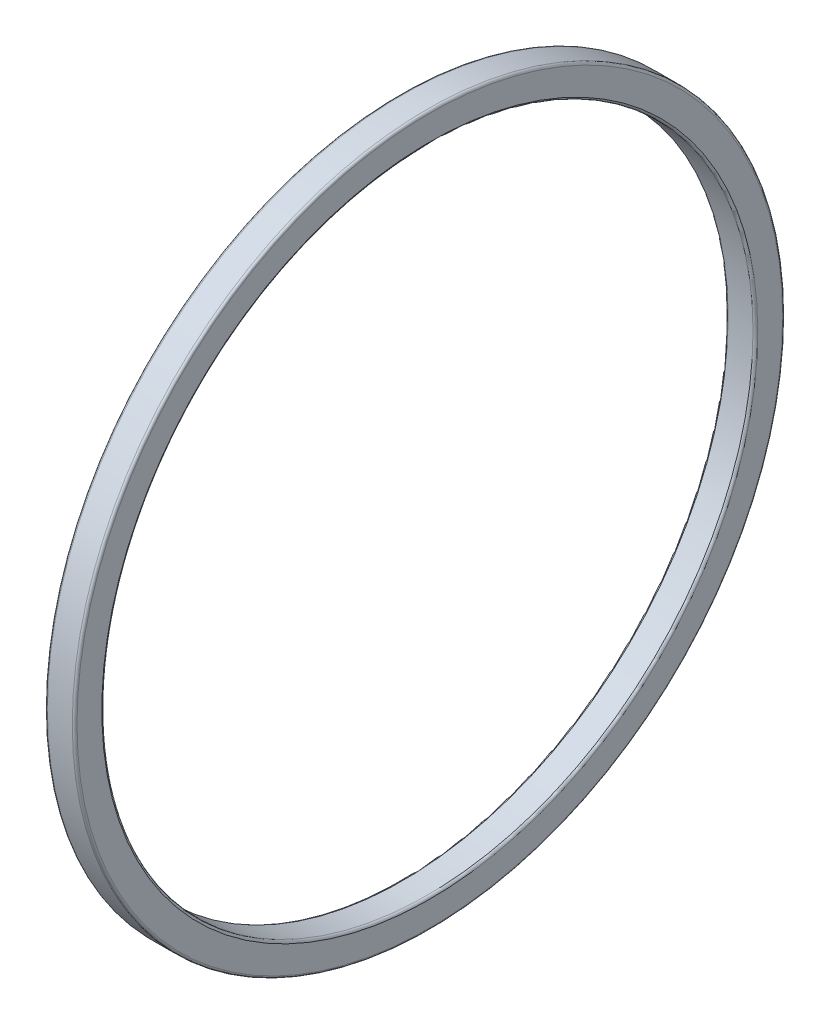
ISO-10303-21;
HEADER;
FILE_DESCRIPTION(('STEP AP214'),'2;1');
FILE_NAME('part.step','',(''),(''),'','','');
FILE_SCHEMA(('AUTOMOTIVE_DESIGN { 1 0 10303 214 1 1 1 1 }'));
ENDSEC;
DATA;
#1=APPLICATION_CONTEXT('core data for automotive mechanical design processes');
#2=APPLICATION_PROTOCOL_DEFINITION('international standard','automotive_design',2000,#1);
#3=PRODUCT_CONTEXT('',#1,'mechanical');
#4=PRODUCT('Part','Part','',(#3));
#5=PRODUCT_RELATED_PRODUCT_CATEGORY('part','',(#4));
#6=PRODUCT_DEFINITION_FORMATION('','',#4);
#7=PRODUCT_DEFINITION_CONTEXT('part definition',#1,'design');
#8=PRODUCT_DEFINITION('design','',#6,#7);
#9=PRODUCT_DEFINITION_SHAPE('','',#8);
#10=(LENGTH_UNIT() NAMED_UNIT(*) SI_UNIT(.MILLI.,.METRE.));
#11=(NAMED_UNIT(*) PLANE_ANGLE_UNIT() SI_UNIT($,.RADIAN.));
#12=(NAMED_UNIT(*) SI_UNIT($,.STERADIAN.) SOLID_ANGLE_UNIT());
#13=UNCERTAINTY_MEASURE_WITH_UNIT(LENGTH_MEASURE(1.E-05),#10,'distance_accuracy_value','');
#14=(GEOMETRIC_REPRESENTATION_CONTEXT(3) GLOBAL_UNCERTAINTY_ASSIGNED_CONTEXT((#13)) GLOBAL_UNIT_ASSIGNED_CONTEXT((#10,
#11,#12)) REPRESENTATION_CONTEXT('',''));
#15=CARTESIAN_POINT('',(0.,0.,0.));
#16=DIRECTION('',(0.,0.,1.));
#17=DIRECTION('',(1.,0.,0.));
#18=AXIS2_PLACEMENT_3D('',#15,#16,#17);
#19=CARTESIAN_POINT('',(3.175,0.,0.));
#20=DIRECTION('',(1.,0.,0.));
#21=DIRECTION('',(0.,0.,-1.));
#22=AXIS2_PLACEMENT_3D('',#19,#20,#21);
#23=PLANE('',#22);
#24=CARTESIAN_POINT('',(3.175,0.,0.));
#25=DIRECTION('',(1.,0.,0.));
#26=DIRECTION('',(0.,0.,-1.));
#27=AXIS2_PLACEMENT_3D('',#24,#25,#26);
#28=CIRCLE('',#27,70.358);
#29=CARTESIAN_POINT('',(3.175,0.,-70.358));
#30=VERTEX_POINT('',#29);
#31=EDGE_CURVE('E10',#30,#30,#28,.F.);
#32=ORIENTED_EDGE('',*,*,#31,.T.);
#33=EDGE_LOOP('',(#32));
#34=FACE_BOUND('',#33,.T.);
#35=CARTESIAN_POINT('',(3.175,0.,0.));
#36=DIRECTION('',(1.,0.,0.));
#37=DIRECTION('',(0.,0.,-1.));
#38=AXIS2_PLACEMENT_3D('',#35,#36,#37);
#39=CIRCLE('',#38,75.692);
#40=CARTESIAN_POINT('',(3.175,0.,-75.692));
#41=VERTEX_POINT('',#40);
#42=EDGE_CURVE('E39',#41,#41,#39,.T.);
#43=ORIENTED_EDGE('',*,*,#42,.T.);
#44=EDGE_LOOP('',(#43));
#45=FACE_BOUND('',#44,.T.);
#46=ADVANCED_FACE('F32',(#34,#45),#23,.T.);
#47=CARTESIAN_POINT('',(-3.175,0.,0.));
#48=DIRECTION('',(1.,0.,0.));
#49=DIRECTION('',(0.,0.,-1.));
#50=AXIS2_PLACEMENT_3D('',#47,#48,#49);
#51=PLANE('',#50);
#52=CARTESIAN_POINT('',(-3.175,0.,0.));
#53=DIRECTION('',(1.,0.,0.));
#54=DIRECTION('',(0.,0.,-1.));
#55=AXIS2_PLACEMENT_3D('',#52,#53,#54);
#56=CIRCLE('',#55,70.358);
#57=CARTESIAN_POINT('',(-3.175,0.,-70.358));
#58=VERTEX_POINT('',#57);
#59=EDGE_CURVE('E58',#58,#58,#56,.T.);
#60=ORIENTED_EDGE('',*,*,#59,.T.);
#61=EDGE_LOOP('',(#60));
#62=FACE_BOUND('',#61,.T.);
#63=CARTESIAN_POINT('',(-3.175,0.,0.));
#64=DIRECTION('',(1.,0.,0.));
#65=DIRECTION('',(0.,0.,-1.));
#66=AXIS2_PLACEMENT_3D('',#63,#64,#65);
#67=CIRCLE('',#66,75.692);
#68=CARTESIAN_POINT('',(-3.175,0.,-75.692));
#69=VERTEX_POINT('',#68);
#70=EDGE_CURVE('E61',#69,#69,#67,.F.);
#71=ORIENTED_EDGE('',*,*,#70,.T.);
#72=EDGE_LOOP('',(#71));
#73=FACE_BOUND('',#72,.T.);
#74=ADVANCED_FACE('F65',(#62,#73),#51,.F.);
#75=CARTESIAN_POINT('',(3.175,0.,0.));
#76=DIRECTION('',(-1.,0.,0.));
#77=DIRECTION('',(0.,0.,1.));
#78=AXIS2_PLACEMENT_3D('',#75,#76,#77);
#79=CYLINDRICAL_SURFACE('',#78,76.2);
#80=CARTESIAN_POINT('',(-2.667,0.,0.));
#81=DIRECTION('',(1.,0.,0.));
#82=DIRECTION('',(0.,0.,-1.));
#83=AXIS2_PLACEMENT_3D('',#80,#81,#82);
#84=CIRCLE('',#83,76.2);
#85=CARTESIAN_POINT('',(-2.667,0.,-76.2));
#86=VERTEX_POINT('',#85);
#87=EDGE_CURVE('E43',#86,#86,#84,.T.);
#88=ORIENTED_EDGE('',*,*,#87,.T.);
#89=EDGE_LOOP('',(#88));
#90=FACE_BOUND('',#89,.T.);
#91=CARTESIAN_POINT('',(2.667,0.,0.));
#92=DIRECTION('',(1.,0.,0.));
#93=DIRECTION('',(0.,0.,-1.));
#94=AXIS2_PLACEMENT_3D('',#91,#92,#93);
#95=CIRCLE('',#94,76.2);
#96=CARTESIAN_POINT('',(2.667,0.,-76.2));
#97=VERTEX_POINT('',#96);
#98=EDGE_CURVE('E47',#97,#97,#95,.F.);
#99=ORIENTED_EDGE('',*,*,#98,.T.);
#100=EDGE_LOOP('',(#99));
#101=FACE_BOUND('',#100,.T.);
#102=ADVANCED_FACE('F75',(#90,#101),#79,.T.);
#103=CARTESIAN_POINT('',(3.175,0.,0.));
#104=DIRECTION('',(-1.,0.,0.));
#105=DIRECTION('',(0.,0.,1.));
#106=AXIS2_PLACEMENT_3D('',#103,#104,#105);
#107=CYLINDRICAL_SURFACE('',#106,69.85);
#108=CARTESIAN_POINT('',(-2.667,0.,0.));
#109=DIRECTION('',(1.,0.,0.));
#110=DIRECTION('',(0.,0.,-1.));
#111=AXIS2_PLACEMENT_3D('',#108,#109,#110);
#112=CIRCLE('',#111,69.85);
#113=CARTESIAN_POINT('',(-2.667,0.,-69.85));
#114=VERTEX_POINT('',#113);
#115=EDGE_CURVE('E52',#114,#114,#112,.F.);
#116=ORIENTED_EDGE('',*,*,#115,.T.);
#117=EDGE_LOOP('',(#116));
#118=FACE_BOUND('',#117,.T.);
#119=CARTESIAN_POINT('',(2.667,0.,0.));
#120=DIRECTION('',(1.,0.,0.));
#121=DIRECTION('',(0.,0.,-1.));
#122=AXIS2_PLACEMENT_3D('',#119,#120,#121);
#123=CIRCLE('',#122,69.85);
#124=CARTESIAN_POINT('',(2.667,0.,-69.85));
#125=VERTEX_POINT('',#124);
#126=EDGE_CURVE('E55',#125,#125,#123,.T.);
#127=ORIENTED_EDGE('',*,*,#126,.T.);
#128=EDGE_LOOP('',(#127));
#129=FACE_BOUND('',#128,.T.);
#130=ADVANCED_FACE('F78',(#118,#129),#107,.F.);
#131=CARTESIAN_POINT('',(-2.667,0.,0.));
#132=DIRECTION('',(1.,0.,0.));
#133=DIRECTION('',(0.,0.,-1.));
#134=AXIS2_PLACEMENT_3D('',#131,#132,#133);
#135=TOROIDAL_SURFACE('',#134,70.358,0.508);
#136=ORIENTED_EDGE('',*,*,#115,.F.);
#137=EDGE_LOOP('',(#136));
#138=FACE_BOUND('',#137,.T.);
#139=ORIENTED_EDGE('',*,*,#59,.F.);
#140=EDGE_LOOP('',(#139));
#141=FACE_BOUND('',#140,.T.);
#142=ADVANCED_FACE('F71',(#138,#141),#135,.T.);
#143=CARTESIAN_POINT('',(-2.667,0.,0.));
#144=DIRECTION('',(1.,0.,0.));
#145=DIRECTION('',(0.,0.,-1.));
#146=AXIS2_PLACEMENT_3D('',#143,#144,#145);
#147=TOROIDAL_SURFACE('',#146,75.692,0.508);
#148=ORIENTED_EDGE('',*,*,#70,.F.);
#149=EDGE_LOOP('',(#148));
#150=FACE_BOUND('',#149,.T.);
#151=ORIENTED_EDGE('',*,*,#87,.F.);
#152=EDGE_LOOP('',(#151));
#153=FACE_BOUND('',#152,.T.);
#154=ADVANCED_FACE('F67',(#150,#153),#147,.T.);
#155=CARTESIAN_POINT('',(2.667,0.,0.));
#156=DIRECTION('',(1.,0.,0.));
#157=DIRECTION('',(0.,0.,-1.));
#158=AXIS2_PLACEMENT_3D('',#155,#156,#157);
#159=TOROIDAL_SURFACE('',#158,70.358,0.508);
#160=ORIENTED_EDGE('',*,*,#31,.F.);
#161=EDGE_LOOP('',(#160));
#162=FACE_BOUND('',#161,.T.);
#163=ORIENTED_EDGE('',*,*,#126,.F.);
#164=EDGE_LOOP('',(#163));
#165=FACE_BOUND('',#164,.T.);
#166=ADVANCED_FACE('F70',(#162,#165),#159,.T.);
#167=CARTESIAN_POINT('',(2.667,0.,0.));
#168=DIRECTION('',(1.,0.,0.));
#169=DIRECTION('',(0.,0.,-1.));
#170=AXIS2_PLACEMENT_3D('',#167,#168,#169);
#171=TOROIDAL_SURFACE('',#170,75.692,0.508);
#172=ORIENTED_EDGE('',*,*,#98,.F.);
#173=EDGE_LOOP('',(#172));
#174=FACE_BOUND('',#173,.T.);
#175=ORIENTED_EDGE('',*,*,#42,.F.);
#176=EDGE_LOOP('',(#175));
#177=FACE_BOUND('',#176,.T.);
#178=ADVANCED_FACE('F34',(#174,#177),#171,.T.);
#179=CLOSED_SHELL('',(#46,#74,#102,#130,#142,#154,#166,#178));
#180=MANIFOLD_SOLID_BREP('B2',#179);
#181=ADVANCED_BREP_SHAPE_REPRESENTATION('',(#18,#180),#14);
#182=SHAPE_DEFINITION_REPRESENTATION(#9,#181);
ENDSEC;
END-ISO-10303-21;
